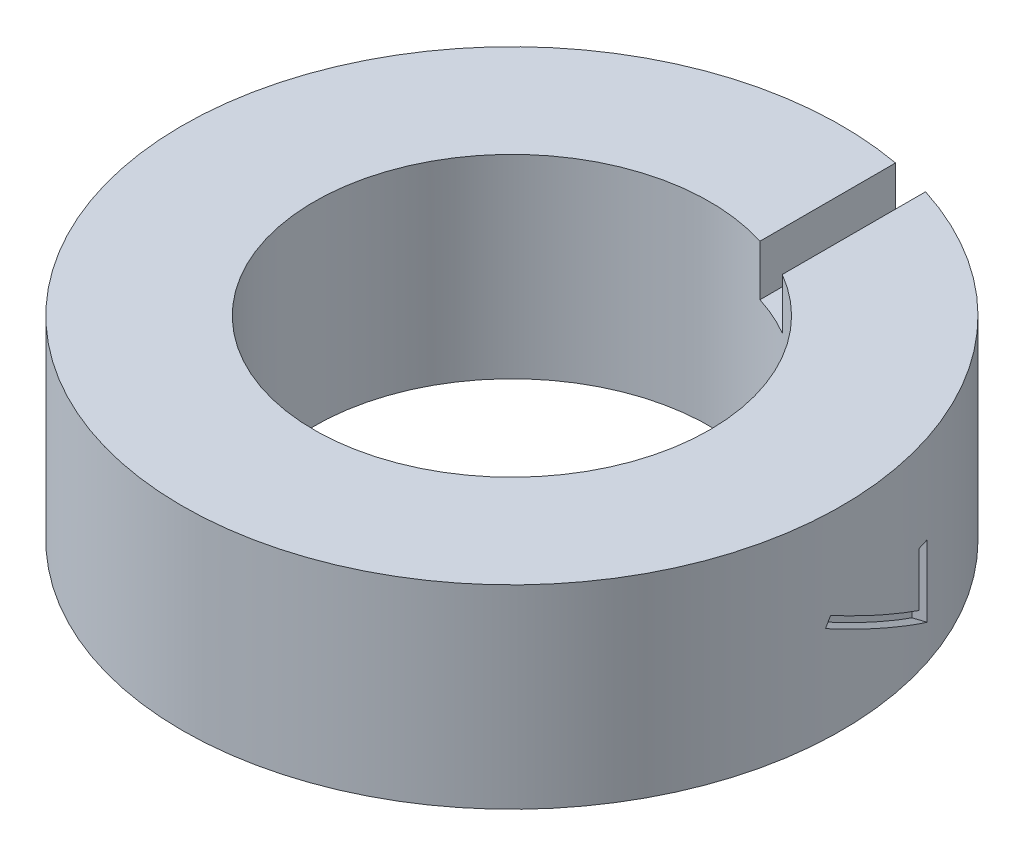
ISO-10303-21;
HEADER;
FILE_DESCRIPTION(('STEP AP214'),'2;1');
FILE_NAME('part.step','',(''),(''),'','','');
FILE_SCHEMA(('AUTOMOTIVE_DESIGN { 1 0 10303 214 1 1 1 1 }'));
ENDSEC;
DATA;
#1=APPLICATION_CONTEXT('core data for automotive mechanical design processes');
#2=APPLICATION_PROTOCOL_DEFINITION('international standard','automotive_design',2000,#1);
#3=PRODUCT_CONTEXT('',#1,'mechanical');
#4=PRODUCT('Part','Part','',(#3));
#5=PRODUCT_RELATED_PRODUCT_CATEGORY('part','',(#4));
#6=PRODUCT_DEFINITION_FORMATION('','',#4);
#7=PRODUCT_DEFINITION_CONTEXT('part definition',#1,'design');
#8=PRODUCT_DEFINITION('design','',#6,#7);
#9=PRODUCT_DEFINITION_SHAPE('','',#8);
#10=(LENGTH_UNIT() NAMED_UNIT(*) SI_UNIT(.MILLI.,.METRE.));
#11=(NAMED_UNIT(*) PLANE_ANGLE_UNIT() SI_UNIT($,.RADIAN.));
#12=(NAMED_UNIT(*) SI_UNIT($,.STERADIAN.) SOLID_ANGLE_UNIT());
#13=UNCERTAINTY_MEASURE_WITH_UNIT(LENGTH_MEASURE(1.E-05),#10,'distance_accuracy_value','');
#14=(GEOMETRIC_REPRESENTATION_CONTEXT(3) GLOBAL_UNCERTAINTY_ASSIGNED_CONTEXT((#13)) GLOBAL_UNIT_ASSIGNED_CONTEXT((#10,
#11,#12)) REPRESENTATION_CONTEXT('',''));
#15=CARTESIAN_POINT('',(0.,0.,0.));
#16=DIRECTION('',(0.,0.,1.));
#17=DIRECTION('',(1.,0.,0.));
#18=AXIS2_PLACEMENT_3D('',#15,#16,#17);
#19=CARTESIAN_POINT('',(0.,7.408333418,0.));
#20=DIRECTION('',(0.,-1.,0.));
#21=DIRECTION('',(0.,0.,-1.));
#22=AXIS2_PLACEMENT_3D('',#19,#20,#21);
#23=CYLINDRICAL_SURFACE('',#22,8.255);
#24=CARTESIAN_POINT('',(0.,0.,0.));
#25=DIRECTION('',(0.,1.,0.));
#26=DIRECTION('',(0.,0.,1.));
#27=AXIS2_PLACEMENT_3D('',#24,#25,#26);
#28=CIRCLE('',#27,8.255);
#29=CARTESIAN_POINT('',(0.,0.,8.255));
#30=VERTEX_POINT('',#29);
#31=EDGE_CURVE('E344',#30,#30,#28,.T.);
#32=ORIENTED_EDGE('',*,*,#31,.T.);
#33=EDGE_LOOP('',(#32));
#34=FACE_BOUND('',#33,.T.);
#35=CARTESIAN_POINT('',(8.25062912415236,2.62649654384789,0.268596455093719));
#36=CARTESIAN_POINT('',(8.24928226512981,2.55128745928512,0.309968684945582));
#37=CARTESIAN_POINT('',(8.24762421280819,2.47607837480489,0.351330783923501));
#38=CARTESIAN_POINT('',(8.24565515478682,2.40086929024212,0.392678072137487));
#39=B_SPLINE_CURVE_WITH_KNOTS('',3,(#35,#36,#37,#38),.UNSPECIFIED.,.F.,.F.,(4,4),(0.,1.),.UNSPECIFIED.);
#40=CARTESIAN_POINT('',(8.24565515478682,2.40086929024212,0.392678072137487));
#41=VERTEX_POINT('',#40);
#42=CARTESIAN_POINT('',(8.25062912415236,2.62649654384789,0.268596455093712));
#43=VERTEX_POINT('',#42);
#44=EDGE_CURVE('E361',#41,#43,#39,.F.);
#45=ORIENTED_EDGE('',*,*,#44,.T.);
#46=CARTESIAN_POINT('',(7.93838256536573,1.31296113719725,-2.26431164946378));
#47=CARTESIAN_POINT('',(8.17271094310577,1.75089454321228,-1.44278679052377));
#48=CARTESIAN_POINT('',(8.27842555032176,2.18856313783286,-0.585242078332182));
#49=CARTESIAN_POINT('',(8.25062912415236,2.62649654384789,0.268596455093712));
#50=B_SPLINE_CURVE_WITH_KNOTS('',3,(#46,#47,#48,#49),.UNSPECIFIED.,.F.,.F.,(4,4),(0.,1.),.UNSPECIFIED.);
#51=CARTESIAN_POINT('',(7.93838256536573,1.31296113719725,-2.26431164946378));
#52=VERTEX_POINT('',#51);
#53=EDGE_CURVE('E257',#43,#52,#50,.F.);
#54=ORIENTED_EDGE('',*,*,#53,.T.);
#55=DIRECTION('',(0.,1.,0.));
#56=VECTOR('',#55,1.);
#57=CARTESIAN_POINT('',(7.93838256536573,1.31296113719725,-2.26431164946378));
#58=LINE('',#57,#56);
#59=CARTESIAN_POINT('',(7.93838256536573,2.66206052955836,-2.26431164946378));
#60=VERTEX_POINT('',#59);
#61=EDGE_CURVE('E176',#52,#60,#58,.T.);
#62=ORIENTED_EDGE('',*,*,#61,.T.);
#63=CARTESIAN_POINT('',(0.,2.66206052955836,0.));
#64=DIRECTION('',(0.,-1.,0.));
#65=DIRECTION('',(0.961645374362899,0.,-0.274295778251215));
#66=AXIS2_PLACEMENT_3D('',#63,#64,#65);
#67=CIRCLE('',#66,8.255);
#68=CARTESIAN_POINT('',(7.85133249202772,2.66206052955836,-2.54982413111763));
#69=VERTEX_POINT('',#68);
#70=EDGE_CURVE('E83',#69,#60,#67,.T.);
#71=ORIENTED_EDGE('',*,*,#70,.F.);
#72=DIRECTION('',(0.,-1.,0.));
#73=VECTOR('',#72,1.);
#74=CARTESIAN_POINT('',(7.85133249202772,2.66206052955836,-2.54982413111763));
#75=LINE('',#74,#73);
#76=CARTESIAN_POINT('',(7.85133249202772,0.871034888532721,-2.54982413111763));
#77=VERTEX_POINT('',#76);
#78=EDGE_CURVE('E340',#69,#77,#75,.T.);
#79=ORIENTED_EDGE('',*,*,#78,.T.);
#80=CARTESIAN_POINT('',(8.24565515478682,2.40086929024212,0.392678072137487));
#81=CARTESIAN_POINT('',(8.29300343126982,1.89074210037182,-0.60156527312282));
#82=CARTESIAN_POINT('',(8.15878479586026,1.38116207840302,-1.60312736353659));
#83=CARTESIAN_POINT('',(7.85133249202772,0.871034888532721,-2.54982413111763));
#84=B_SPLINE_CURVE_WITH_KNOTS('',3,(#80,#81,#82,#83),.UNSPECIFIED.,.F.,.F.,(4,4),(0.,1.),.UNSPECIFIED.);
#85=EDGE_CURVE('E351',#77,#41,#84,.F.);
#86=ORIENTED_EDGE('',*,*,#85,.T.);
#87=EDGE_LOOP('',(#45,#54,#62,#71,#79,#86));
#88=FACE_BOUND('',#87,.T.);
#89=CARTESIAN_POINT('',(0.,3.598333418,0.));
#90=DIRECTION('',(0.,1.,0.));
#91=DIRECTION('',(0.,0.,1.));
#92=AXIS2_PLACEMENT_3D('',#89,#90,#91);
#93=CIRCLE('',#92,8.255);
#94=CARTESIAN_POINT('',(2.49008679760509,3.598333418,-7.87048237024852));
#95=VERTEX_POINT('',#94);
#96=CARTESIAN_POINT('',(1.48864278200744,3.598333418,-8.11966548988178));
#97=VERTEX_POINT('',#96);
#98=EDGE_CURVE('E167',#95,#97,#93,.T.);
#99=ORIENTED_EDGE('',*,*,#98,.F.);
#100=DIRECTION('',(0.,-1.,0.));
#101=VECTOR('',#100,1.);
#102=CARTESIAN_POINT('',(2.49008679760509,7.408333418,-7.87048237024852));
#103=LINE('',#102,#101);
#104=CARTESIAN_POINT('',(2.49008679760509,4.868333418,-7.87048237024852));
#105=VERTEX_POINT('',#104);
#106=EDGE_CURVE('E151',#95,#105,#103,.F.);
#107=ORIENTED_EDGE('',*,*,#106,.T.);
#108=CARTESIAN_POINT('',(0.,4.868333418,0.));
#109=DIRECTION('',(0.,1.,0.));
#110=DIRECTION('',(0.,0.,1.));
#111=AXIS2_PLACEMENT_3D('',#108,#109,#110);
#112=CIRCLE('',#111,8.255);
#113=CARTESIAN_POINT('',(1.48864278200744,4.868333418,-8.11966548988178));
#114=VERTEX_POINT('',#113);
#115=EDGE_CURVE('E170',#114,#105,#112,.T.);
#116=ORIENTED_EDGE('',*,*,#115,.F.);
#117=DIRECTION('',(0.,-1.,0.));
#118=VECTOR('',#117,1.);
#119=CARTESIAN_POINT('',(1.48864278200744,7.408333418,-8.11966548988178));
#120=LINE('',#119,#118);
#121=EDGE_CURVE('E75',#114,#97,#120,.T.);
#122=ORIENTED_EDGE('',*,*,#121,.T.);
#123=EDGE_LOOP('',(#99,#107,#116,#122));
#124=FACE_BOUND('',#123,.T.);
#125=ADVANCED_FACE('F60',(#34,#88,#124),#23,.T.);
#126=CARTESIAN_POINT('',(0.,7.408333418,0.));
#127=DIRECTION('',(0.,-1.,0.));
#128=DIRECTION('',(0.,0.,-1.));
#129=AXIS2_PLACEMENT_3D('',#126,#127,#128);
#130=CYLINDRICAL_SURFACE('',#129,4.953);
#131=DIRECTION('',(0.,1.,0.));
#132=VECTOR('',#131,1.);
#133=CARTESIAN_POINT('',(2.49008679760509,3.598333418,-4.28155074013993));
#134=LINE('',#133,#132);
#135=CARTESIAN_POINT('',(2.49008679760509,3.598333418,-4.28155074013993));
#136=VERTEX_POINT('',#135);
#137=CARTESIAN_POINT('',(2.49008679760509,4.868333418,-4.28155074013993));
#138=VERTEX_POINT('',#137);
#139=EDGE_CURVE('E148',#136,#138,#134,.T.);
#140=ORIENTED_EDGE('',*,*,#139,.F.);
#141=CARTESIAN_POINT('',(0.,3.598333418,0.));
#142=DIRECTION('',(0.,1.,0.));
#143=DIRECTION('',(0.,0.,1.));
#144=AXIS2_PLACEMENT_3D('',#141,#142,#143);
#145=CIRCLE('',#144,4.953);
#146=CARTESIAN_POINT('',(1.48864278200744,3.598333418,-4.72399742459468));
#147=VERTEX_POINT('',#146);
#148=EDGE_CURVE('E13',#136,#147,#145,.T.);
#149=ORIENTED_EDGE('',*,*,#148,.T.);
#150=DIRECTION('',(0.,-1.,0.));
#151=VECTOR('',#150,1.);
#152=CARTESIAN_POINT('',(1.48864278200744,7.408333418,-4.72399742459468));
#153=LINE('',#152,#151);
#154=CARTESIAN_POINT('',(1.48864278200744,4.868333418,-4.72399742459468));
#155=VERTEX_POINT('',#154);
#156=EDGE_CURVE('E159',#155,#147,#153,.T.);
#157=ORIENTED_EDGE('',*,*,#156,.F.);
#158=CARTESIAN_POINT('',(0.,4.868333418,0.));
#159=DIRECTION('',(0.,1.,0.));
#160=DIRECTION('',(0.,0.,1.));
#161=AXIS2_PLACEMENT_3D('',#158,#159,#160);
#162=CIRCLE('',#161,4.953);
#163=EDGE_CURVE('E158',#155,#138,#162,.T.);
#164=ORIENTED_EDGE('',*,*,#163,.T.);
#165=EDGE_LOOP('',(#140,#149,#157,#164));
#166=FACE_BOUND('',#165,.T.);
#167=CARTESIAN_POINT('',(0.,0.,0.));
#168=DIRECTION('',(0.,1.,0.));
#169=DIRECTION('',(0.,0.,1.));
#170=AXIS2_PLACEMENT_3D('',#167,#168,#169);
#171=CIRCLE('',#170,4.953);
#172=CARTESIAN_POINT('',(0.,0.,4.953));
#173=VERTEX_POINT('',#172);
#174=EDGE_CURVE('E341',#173,#173,#171,.T.);
#175=ORIENTED_EDGE('',*,*,#174,.F.);
#176=EDGE_LOOP('',(#175));
#177=FACE_BOUND('',#176,.T.);
#178=ADVANCED_FACE('F155',(#166,#177),#130,.F.);
#179=CARTESIAN_POINT('',(0.,0.,0.));
#180=DIRECTION('',(0.,1.,0.));
#181=DIRECTION('',(0.,0.,1.));
#182=AXIS2_PLACEMENT_3D('',#179,#180,#181);
#183=PLANE('',#182);
#184=ORIENTED_EDGE('',*,*,#31,.F.);
#185=EDGE_LOOP('',(#184));
#186=FACE_BOUND('',#185,.T.);
#187=ORIENTED_EDGE('',*,*,#174,.T.);
#188=EDGE_LOOP('',(#187));
#189=FACE_BOUND('',#188,.T.);
#190=ADVANCED_FACE('F277',(#186,#189),#183,.F.);
#191=CARTESIAN_POINT('',(8.25062912415236,2.62649654384789,0.268596455093712));
#192=CARTESIAN_POINT('',(8.27842555032176,2.18856313783286,-0.585242078332182));
#193=CARTESIAN_POINT('',(8.17271094310577,1.75089454321228,-1.44278679052377));
#194=CARTESIAN_POINT('',(7.93838256536573,1.31296113719725,-2.26431164946378));
#195=CARTESIAN_POINT('',(7.95078796882277,2.62649654384789,0.258835227167835));
#196=CARTESIAN_POINT('',(7.97757415168407,2.18856438686196,-0.563971091564744));
#197=CARTESIAN_POINT('',(7.87570081597344,1.75089329418319,-1.39035585193643));
#198=CARTESIAN_POINT('',(7.64988895305686,1.31296113719725,-2.18202291598841));
#199=B_SPLINE_SURFACE_WITH_KNOTS('',1,3,((#191,#192,#193,#194),(#195,#196,#197,#198)),
.UNSPECIFIED.,.F.,.F.,.F.,(2,2),(4,4),(0.,1.),(0.,1.),.UNSPECIFIED.);
#200=CARTESIAN_POINT('',(7.64988895305686,1.31296113719725,-2.18202291598841));
#201=CARTESIAN_POINT('',(7.93838256536573,1.31296113719725,-2.26431164946378));
#202=B_SPLINE_CURVE_WITH_KNOTS('',1,(#200,#201),.UNSPECIFIED.,.F.,.F.,(2,2),(0.,1.),.UNSPECIFIED.);
#203=CARTESIAN_POINT('',(7.64988895305686,1.31296113719725,-2.18202291598841));
#204=VERTEX_POINT('',#203);
#205=EDGE_CURVE('E320',#204,#52,#202,.T.);
#206=CARTESIAN_POINT('',(7.95078796882277,2.62649654384789,0.258835227167842));
#207=CARTESIAN_POINT('',(8.25062912415236,2.62649654384789,0.268596455093719));
#208=B_SPLINE_CURVE_WITH_KNOTS('',1,(#206,#207),.UNSPECIFIED.,.F.,.F.,(2,2),(0.,1.),.UNSPECIFIED.);
#209=CARTESIAN_POINT('',(7.95078796882277,2.62649654384789,0.258835227167835));
#210=VERTEX_POINT('',#209);
#211=EDGE_CURVE('E308',#210,#43,#208,.T.);
#212=CARTESIAN_POINT('',(7.95078796882277,2.62649654384789,0.258835227167835));
#213=CARTESIAN_POINT('',(7.97757415168407,2.18856438686196,-0.563971091564744));
#214=CARTESIAN_POINT('',(7.87570081597344,1.75089329418319,-1.39035585193643));
#215=CARTESIAN_POINT('',(7.64988895305686,1.31296113719725,-2.18202291598841));
#216=B_SPLINE_CURVE_WITH_KNOTS('',3,(#212,#213,#214,#215),.UNSPECIFIED.,.F.,.F.,(4,4),(0.,1.),.UNSPECIFIED.);
#217=EDGE_CURVE('E245',#210,#204,#216,.T.);
#218=ORIENTED_EDGE('',*,*,#205,.T.);
#219=ORIENTED_EDGE('',*,*,#53,.F.);
#220=ORIENTED_EDGE('',*,*,#211,.F.);
#221=ORIENTED_EDGE('',*,*,#217,.T.);
#222=EDGE_LOOP('',(#218,#219,#220,#221));
#223=FACE_BOUND('',#222,.T.);
#224=ADVANCED_FACE('F264',(#223),#199,.T.);
#225=CARTESIAN_POINT('',(8.24565515478682,2.40086929024212,0.392678072137487));
#226=CARTESIAN_POINT('',(8.24762421280819,2.47607837480489,0.351330783923501));
#227=CARTESIAN_POINT('',(8.24928226512981,2.55128745928512,0.309968684945582));
#228=CARTESIAN_POINT('',(8.25062912415236,2.62649654384789,0.268596455093719));
#229=CARTESIAN_POINT('',(7.94599476151776,2.40086929024212,0.378407518334792));
#230=CARTESIAN_POINT('',(7.94789226079816,2.47607837480336,0.33856285719178));
#231=CARTESIAN_POINT('',(7.94949005682712,2.55128745928666,0.298703923529425));
#232=CARTESIAN_POINT('',(7.95078796882277,2.62649654384789,0.258835227167842));
#233=B_SPLINE_SURFACE_WITH_KNOTS('',1,3,((#225,#226,#227,#228),(#229,#230,#231,#232)),
.UNSPECIFIED.,.F.,.F.,.F.,(2,2),(4,4),(0.,1.),(0.,1.),.UNSPECIFIED.);
#234=CARTESIAN_POINT('',(7.94599476151776,2.40086929024212,0.378407518334792));
#235=CARTESIAN_POINT('',(8.24565515478682,2.40086929024212,0.392678072137487));
#236=B_SPLINE_CURVE_WITH_KNOTS('',1,(#234,#235),.UNSPECIFIED.,.F.,.F.,(2,2),(0.,1.),.UNSPECIFIED.);
#237=CARTESIAN_POINT('',(7.94599476151776,2.40086929024212,0.378407518334792));
#238=VERTEX_POINT('',#237);
#239=EDGE_CURVE('E518',#238,#41,#236,.T.);
#240=CARTESIAN_POINT('',(7.94599476151776,2.40086929024212,0.378407518334792));
#241=CARTESIAN_POINT('',(7.94789226079816,2.47607837480336,0.33856285719178));
#242=CARTESIAN_POINT('',(7.94949005682712,2.55128745928666,0.298703923529425));
#243=CARTESIAN_POINT('',(7.95078796882277,2.62649654384789,0.258835227167842));
#244=B_SPLINE_CURVE_WITH_KNOTS('',3,(#240,#241,#242,#243),.UNSPECIFIED.,.F.,.F.,(4,4),(0.,1.),.UNSPECIFIED.);
#245=EDGE_CURVE('E225',#238,#210,#244,.T.);
#246=ORIENTED_EDGE('',*,*,#211,.T.);
#247=ORIENTED_EDGE('',*,*,#44,.F.);
#248=ORIENTED_EDGE('',*,*,#239,.F.);
#249=ORIENTED_EDGE('',*,*,#245,.T.);
#250=EDGE_LOOP('',(#246,#247,#248,#249));
#251=FACE_BOUND('',#250,.T.);
#252=ADVANCED_FACE('F276',(#251),#233,.T.);
#253=CARTESIAN_POINT('',(7.85133249202772,0.871034888532721,-2.54982413111763));
#254=CARTESIAN_POINT('',(8.15878479586026,1.38116207840302,-1.60312736353659));
#255=CARTESIAN_POINT('',(8.29300343126982,1.89074210037182,-0.60156527312282));
#256=CARTESIAN_POINT('',(8.24565515478682,2.40086929024212,0.392678072137487));
#257=CARTESIAN_POINT('',(7.56600241963422,0.871034888532721,-2.45715941405702));
#258=CARTESIAN_POINT('',(7.862279964704,1.3811595875191,-1.54487158687854));
#259=CARTESIAN_POINT('',(7.99162210255506,1.89074459125574,-0.579698743559197));
#260=CARTESIAN_POINT('',(7.94599476151776,2.40086929024212,0.378407518334792));
#261=B_SPLINE_SURFACE_WITH_KNOTS('',1,3,((#253,#254,#255,#256),(#257,#258,#259,#260)),
.UNSPECIFIED.,.F.,.F.,.F.,(2,2),(4,4),(0.,1.),(0.,1.),.UNSPECIFIED.);
#262=CARTESIAN_POINT('',(7.85133249202772,0.871034888532721,-2.54982413111763));
#263=CARTESIAN_POINT('',(7.56600241963422,0.871034888532721,-2.45715941405702));
#264=B_SPLINE_CURVE_WITH_KNOTS('',1,(#262,#263),.UNSPECIFIED.,.F.,.F.,(2,2),(0.,1.),.UNSPECIFIED.);
#265=CARTESIAN_POINT('',(7.56600241963422,0.871034888532721,-2.45715941405702));
#266=VERTEX_POINT('',#265);
#267=EDGE_CURVE('E494',#266,#77,#264,.F.);
#268=CARTESIAN_POINT('',(7.56600241963422,0.871034888532721,-2.45715941405702));
#269=CARTESIAN_POINT('',(7.862279964704,1.3811595875191,-1.54487158687854));
#270=CARTESIAN_POINT('',(7.99162210255506,1.89074459125574,-0.579698743559197));
#271=CARTESIAN_POINT('',(7.94599476151776,2.40086929024212,0.378407518334792));
#272=B_SPLINE_CURVE_WITH_KNOTS('',3,(#268,#269,#270,#271),.UNSPECIFIED.,.F.,.F.,(4,4),(0.,1.),.UNSPECIFIED.);
#273=EDGE_CURVE('E522',#266,#238,#272,.T.);
#274=ORIENTED_EDGE('',*,*,#239,.T.);
#275=ORIENTED_EDGE('',*,*,#85,.F.);
#276=ORIENTED_EDGE('',*,*,#267,.F.);
#277=ORIENTED_EDGE('',*,*,#273,.T.);
#278=EDGE_LOOP('',(#274,#275,#276,#277));
#279=FACE_BOUND('',#278,.T.);
#280=ADVANCED_FACE('F407',(#279),#261,.T.);
#281=CARTESIAN_POINT('',(7.85133249202772,1.76654770904554,-2.54982413111763));
#282=DIRECTION('',(0.308882390202014,0.,0.951100241311656));
#283=DIRECTION('',(0.,-1.,0.));
#284=AXIS2_PLACEMENT_3D('',#281,#282,#283);
#285=PLANE('',#284);
#286=ORIENTED_EDGE('',*,*,#267,.T.);
#287=ORIENTED_EDGE('',*,*,#78,.F.);
#288=DIRECTION('',(0.951100241311656,0.,-0.308882390202014));
#289=VECTOR('',#288,1.);
#290=CARTESIAN_POINT('',(7.85133249202772,2.66206052955836,-2.54982413111763));
#291=LINE('',#290,#289);
#292=CARTESIAN_POINT('',(7.56600241963422,2.66206052955836,-2.45715941405702));
#293=VERTEX_POINT('',#292);
#294=EDGE_CURVE('E339',#293,#69,#291,.T.);
#295=ORIENTED_EDGE('',*,*,#294,.F.);
#296=DIRECTION('',(0.,-1.,0.));
#297=VECTOR('',#296,1.);
#298=CARTESIAN_POINT('',(7.56600241963422,7.408333418,-2.45715941405702));
#299=LINE('',#298,#297);
#300=EDGE_CURVE('E177',#293,#266,#299,.T.);
#301=ORIENTED_EDGE('',*,*,#300,.T.);
#302=EDGE_LOOP('',(#286,#287,#295,#301));
#303=FACE_BOUND('',#302,.T.);
#304=ADVANCED_FACE('F413',(#303),#285,.T.);
#305=CARTESIAN_POINT('',(0.,2.66206052955836,0.));
#306=DIRECTION('',(0.,1.,0.));
#307=DIRECTION('',(0.,0.,1.));
#308=AXIS2_PLACEMENT_3D('',#305,#306,#307);
#309=PLANE('',#308);
#310=ORIENTED_EDGE('',*,*,#294,.T.);
#311=ORIENTED_EDGE('',*,*,#70,.T.);
#312=DIRECTION('',(0.961645374362899,0.,-0.274295778251215));
#313=VECTOR('',#312,1.);
#314=CARTESIAN_POINT('',(7.93838256536573,2.66206052955836,-2.26431164946378));
#315=LINE('',#314,#313);
#316=CARTESIAN_POINT('',(7.64988895305686,2.66206052955836,-2.18202291598841));
#317=VERTEX_POINT('',#316);
#318=EDGE_CURVE('E332',#317,#60,#315,.T.);
#319=ORIENTED_EDGE('',*,*,#318,.F.);
#320=CARTESIAN_POINT('',(0.,2.66206052955836,0.));
#321=DIRECTION('',(0.,-1.,0.));
#322=DIRECTION('',(0.,0.,-1.));
#323=AXIS2_PLACEMENT_3D('',#320,#321,#322);
#324=CIRCLE('',#323,7.955);
#325=EDGE_CURVE('E173',#293,#317,#324,.T.);
#326=ORIENTED_EDGE('',*,*,#325,.F.);
#327=EDGE_LOOP('',(#310,#311,#319,#326));
#328=FACE_BOUND('',#327,.T.);
#329=ADVANCED_FACE('F202',(#328),#309,.F.);
#330=CARTESIAN_POINT('',(7.93838256536573,1.98751083337781,-2.26431164946378));
#331=DIRECTION('',(-0.274295778251215,0.,-0.961645374362899));
#332=DIRECTION('',(0.,1.,0.));
#333=AXIS2_PLACEMENT_3D('',#330,#331,#332);
#334=PLANE('',#333);
#335=DIRECTION('',(0.,-1.,0.));
#336=VECTOR('',#335,1.);
#337=CARTESIAN_POINT('',(7.64988895305686,7.408333418,-2.18202291598841));
#338=LINE('',#337,#336);
#339=EDGE_CURVE('E181',#204,#317,#338,.F.);
#340=ORIENTED_EDGE('',*,*,#339,.T.);
#341=ORIENTED_EDGE('',*,*,#318,.T.);
#342=ORIENTED_EDGE('',*,*,#61,.F.);
#343=ORIENTED_EDGE('',*,*,#205,.F.);
#344=EDGE_LOOP('',(#340,#341,#342,#343));
#345=FACE_BOUND('',#344,.T.);
#346=ADVANCED_FACE('F199',(#345),#334,.T.);
#347=CARTESIAN_POINT('',(0.,7.408333418,0.));
#348=DIRECTION('',(0.,-1.,0.));
#349=DIRECTION('',(0.,0.,-1.));
#350=AXIS2_PLACEMENT_3D('',#347,#348,#349);
#351=CYLINDRICAL_SURFACE('',#350,7.955);
#352=ORIENTED_EDGE('',*,*,#325,.T.);
#353=ORIENTED_EDGE('',*,*,#339,.F.);
#354=ORIENTED_EDGE('',*,*,#217,.F.);
#355=ORIENTED_EDGE('',*,*,#245,.F.);
#356=ORIENTED_EDGE('',*,*,#273,.F.);
#357=ORIENTED_EDGE('',*,*,#300,.F.);
#358=EDGE_LOOP('',(#352,#353,#354,#355,#356,#357));
#359=FACE_BOUND('',#358,.T.);
#360=ADVANCED_FACE('F188',(#359),#351,.T.);
#361=CARTESIAN_POINT('',(0.,4.868333418,0.));
#362=DIRECTION('',(0.,1.,0.));
#363=DIRECTION('',(0.,0.,1.));
#364=AXIS2_PLACEMENT_3D('',#361,#362,#363);
#365=PLANE('',#364);
#366=DIRECTION('',(0.,0.,-1.));
#367=VECTOR('',#366,1.);
#368=CARTESIAN_POINT('',(2.49008679760509,4.868333418,-4.28155074013993));
#369=LINE('',#368,#367);
#370=EDGE_CURVE('E152',#138,#105,#369,.T.);
#371=ORIENTED_EDGE('',*,*,#370,.F.);
#372=ORIENTED_EDGE('',*,*,#163,.F.);
#373=DIRECTION('',(0.,0.,1.));
#374=VECTOR('',#373,1.);
#375=CARTESIAN_POINT('',(1.48864278200744,4.868333418,0.));
#376=LINE('',#375,#374);
#377=EDGE_CURVE('E68',#114,#155,#376,.T.);
#378=ORIENTED_EDGE('',*,*,#377,.F.);
#379=ORIENTED_EDGE('',*,*,#115,.T.);
#380=EDGE_LOOP('',(#371,#372,#378,#379));
#381=FACE_BOUND('',#380,.T.);
#382=ADVANCED_FACE('F198',(#381),#365,.T.);
#383=CARTESIAN_POINT('',(0.,3.598333418,0.));
#384=DIRECTION('',(0.,1.,0.));
#385=DIRECTION('',(0.,0.,1.));
#386=AXIS2_PLACEMENT_3D('',#383,#384,#385);
#387=PLANE('',#386);
#388=ORIENTED_EDGE('',*,*,#98,.T.);
#389=DIRECTION('',(0.,0.,1.));
#390=VECTOR('',#389,1.);
#391=CARTESIAN_POINT('',(1.48864278200744,3.598333418,-4.28155074013993));
#392=LINE('',#391,#390);
#393=EDGE_CURVE('E142',#97,#147,#392,.T.);
#394=ORIENTED_EDGE('',*,*,#393,.T.);
#395=ORIENTED_EDGE('',*,*,#148,.F.);
#396=DIRECTION('',(0.,0.,-1.));
#397=VECTOR('',#396,1.);
#398=CARTESIAN_POINT('',(2.49008679760509,3.598333418,-4.28155074013993));
#399=LINE('',#398,#397);
#400=EDGE_CURVE('E140',#136,#95,#399,.T.);
#401=ORIENTED_EDGE('',*,*,#400,.T.);
#402=EDGE_LOOP('',(#388,#394,#395,#401));
#403=FACE_BOUND('',#402,.T.);
#404=ADVANCED_FACE('F139',(#403),#387,.T.);
#405=CARTESIAN_POINT('',(2.49008679760509,3.598333418,-4.28155074013993));
#406=DIRECTION('',(1.,0.,0.));
#407=DIRECTION('',(0.,0.,-1.));
#408=AXIS2_PLACEMENT_3D('',#405,#406,#407);
#409=PLANE('',#408);
#410=ORIENTED_EDGE('',*,*,#400,.F.);
#411=ORIENTED_EDGE('',*,*,#139,.T.);
#412=ORIENTED_EDGE('',*,*,#370,.T.);
#413=ORIENTED_EDGE('',*,*,#106,.F.);
#414=EDGE_LOOP('',(#410,#411,#412,#413));
#415=FACE_BOUND('',#414,.T.);
#416=ADVANCED_FACE('F147',(#415),#409,.F.);
#417=CARTESIAN_POINT('',(1.48864278200744,3.598333418,-4.28155074013993));
#418=DIRECTION('',(-1.,0.,0.));
#419=DIRECTION('',(0.,0.,1.));
#420=AXIS2_PLACEMENT_3D('',#417,#418,#419);
#421=PLANE('',#420);
#422=ORIENTED_EDGE('',*,*,#377,.T.);
#423=ORIENTED_EDGE('',*,*,#156,.T.);
#424=ORIENTED_EDGE('',*,*,#393,.F.);
#425=ORIENTED_EDGE('',*,*,#121,.F.);
#426=EDGE_LOOP('',(#422,#423,#424,#425));
#427=FACE_BOUND('',#426,.T.);
#428=ADVANCED_FACE('F379',(#427),#421,.F.);
#429=CLOSED_SHELL('',(#125,#178,#190,#224,#252,#280,#304,#329,#346,#360,#382,#404,#416,#428));
#430=MANIFOLD_SOLID_BREP('B2',#429);
#431=ADVANCED_BREP_SHAPE_REPRESENTATION('',(#18,#430),#14);
#432=SHAPE_DEFINITION_REPRESENTATION(#9,#431);
ENDSEC;
END-ISO-10303-21;
